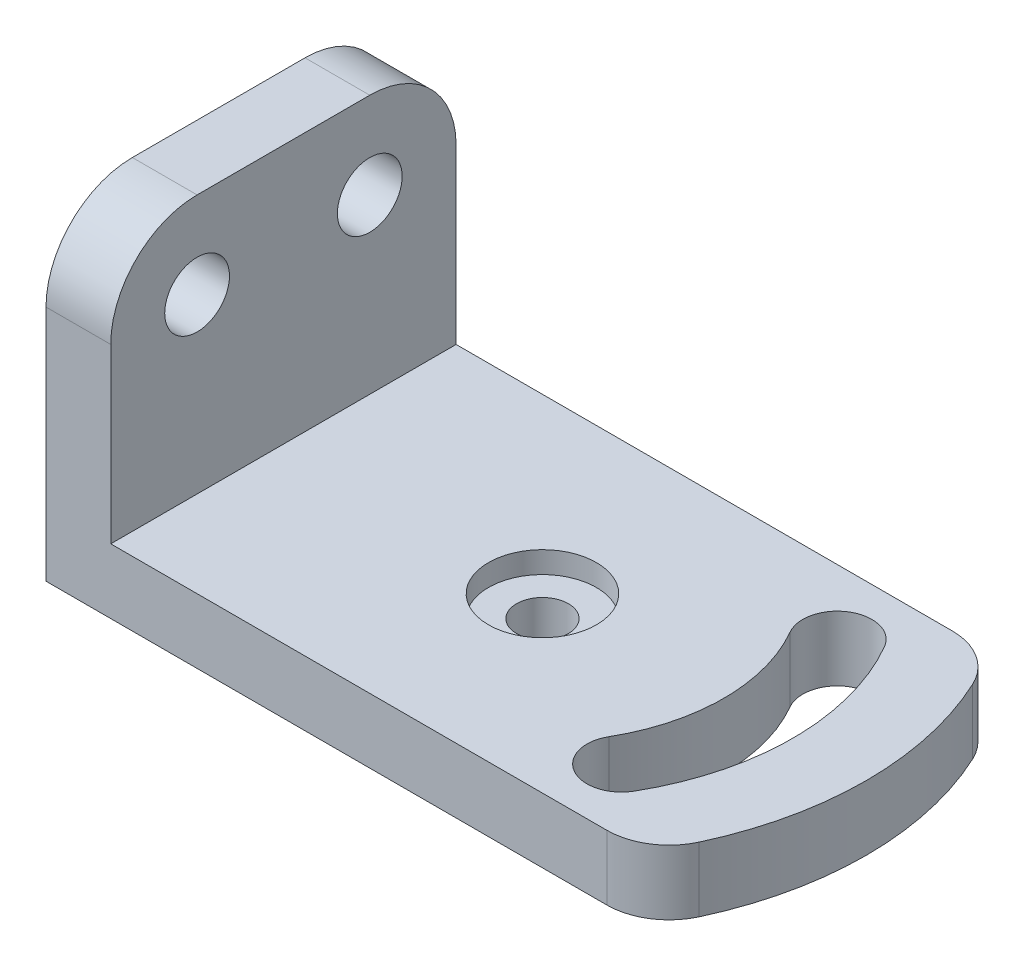
ISO-10303-21;
HEADER;
FILE_DESCRIPTION(('STEP AP214'),'2;1');
FILE_NAME('part.step','',(''),(''),'','','');
FILE_SCHEMA(('AUTOMOTIVE_DESIGN { 1 0 10303 214 1 1 1 1 }'));
ENDSEC;
DATA;
#1=APPLICATION_CONTEXT('core data for automotive mechanical design processes');
#2=APPLICATION_PROTOCOL_DEFINITION('international standard','automotive_design',2000,#1);
#3=PRODUCT_CONTEXT('',#1,'mechanical');
#4=PRODUCT('Part','Part','',(#3));
#5=PRODUCT_RELATED_PRODUCT_CATEGORY('part','',(#4));
#6=PRODUCT_DEFINITION_FORMATION('','',#4);
#7=PRODUCT_DEFINITION_CONTEXT('part definition',#1,'design');
#8=PRODUCT_DEFINITION('design','',#6,#7);
#9=PRODUCT_DEFINITION_SHAPE('','',#8);
#10=(LENGTH_UNIT() NAMED_UNIT(*) SI_UNIT(.MILLI.,.METRE.));
#11=(NAMED_UNIT(*) PLANE_ANGLE_UNIT() SI_UNIT($,.RADIAN.));
#12=(NAMED_UNIT(*) SI_UNIT($,.STERADIAN.) SOLID_ANGLE_UNIT());
#13=UNCERTAINTY_MEASURE_WITH_UNIT(LENGTH_MEASURE(1.E-05),#10,'distance_accuracy_value','');
#14=(GEOMETRIC_REPRESENTATION_CONTEXT(3) GLOBAL_UNCERTAINTY_ASSIGNED_CONTEXT((#13)) GLOBAL_UNIT_ASSIGNED_CONTEXT((#10,
#11,#12)) REPRESENTATION_CONTEXT('',''));
#15=CARTESIAN_POINT('',(0.,0.,0.));
#16=DIRECTION('',(0.,0.,1.));
#17=DIRECTION('',(1.,0.,0.));
#18=AXIS2_PLACEMENT_3D('',#15,#16,#17);
#19=CARTESIAN_POINT('',(15.,75.,0.));
#20=DIRECTION('',(-1.,0.,0.));
#21=DIRECTION('',(0.,0.,1.));
#22=AXIS2_PLACEMENT_3D('',#19,#20,#21);
#23=PLANE('',#22);
#24=CARTESIAN_POINT('',(15.,55.,-20.));
#25=DIRECTION('',(-1.,0.,0.));
#26=DIRECTION('',(0.,0.,1.));
#27=AXIS2_PLACEMENT_3D('',#24,#25,#26);
#28=CIRCLE('',#27,7.5);
#29=CARTESIAN_POINT('',(15.,55.,-12.5));
#30=VERTEX_POINT('',#29);
#31=EDGE_CURVE('E328',#30,#30,#28,.F.);
#32=ORIENTED_EDGE('',*,*,#31,.F.);
#33=EDGE_LOOP('',(#32));
#34=FACE_BOUND('',#33,.T.);
#35=CARTESIAN_POINT('',(15.,55.,20.));
#36=DIRECTION('',(-1.,0.,0.));
#37=DIRECTION('',(0.,0.,1.));
#38=AXIS2_PLACEMENT_3D('',#35,#36,#37);
#39=CIRCLE('',#38,20.);
#40=CARTESIAN_POINT('',(15.,55.,40.));
#41=VERTEX_POINT('',#40);
#42=CARTESIAN_POINT('',(15.,75.,20.));
#43=VERTEX_POINT('',#42);
#44=EDGE_CURVE('E186',#41,#43,#39,.T.);
#45=ORIENTED_EDGE('',*,*,#44,.F.);
#46=DIRECTION('',(0.,-1.,0.));
#47=VECTOR('',#46,1.);
#48=CARTESIAN_POINT('',(15.,75.,40.));
#49=LINE('',#48,#47);
#50=CARTESIAN_POINT('',(15.,15.,40.));
#51=VERTEX_POINT('',#50);
#52=EDGE_CURVE('E206',#41,#51,#49,.T.);
#53=ORIENTED_EDGE('',*,*,#52,.T.);
#54=DIRECTION('',(0.,0.,-1.));
#55=VECTOR('',#54,1.);
#56=CARTESIAN_POINT('',(15.,15.,0.));
#57=LINE('',#56,#55);
#58=CARTESIAN_POINT('',(15.,15.,-40.));
#59=VERTEX_POINT('',#58);
#60=EDGE_CURVE('E242',#51,#59,#57,.T.);
#61=ORIENTED_EDGE('',*,*,#60,.T.);
#62=DIRECTION('',(0.,-1.,0.));
#63=VECTOR('',#62,1.);
#64=CARTESIAN_POINT('',(15.,75.,-40.));
#65=LINE('',#64,#63);
#66=CARTESIAN_POINT('',(15.,55.,-40.));
#67=VERTEX_POINT('',#66);
#68=EDGE_CURVE('E94',#67,#59,#65,.T.);
#69=ORIENTED_EDGE('',*,*,#68,.F.);
#70=CARTESIAN_POINT('',(15.,55.,-20.));
#71=DIRECTION('',(-1.,0.,0.));
#72=DIRECTION('',(0.,0.,1.));
#73=AXIS2_PLACEMENT_3D('',#70,#71,#72);
#74=CIRCLE('',#73,20.);
#75=CARTESIAN_POINT('',(15.,75.,-20.));
#76=VERTEX_POINT('',#75);
#77=EDGE_CURVE('E339',#67,#76,#74,.F.);
#78=ORIENTED_EDGE('',*,*,#77,.T.);
#79=DIRECTION('',(0.,0.,-1.));
#80=VECTOR('',#79,1.);
#81=CARTESIAN_POINT('',(15.,75.,0.));
#82=LINE('',#81,#80);
#83=EDGE_CURVE('E210',#43,#76,#82,.T.);
#84=ORIENTED_EDGE('',*,*,#83,.F.);
#85=EDGE_LOOP('',(#45,#53,#61,#69,#78,#84));
#86=FACE_BOUND('',#85,.T.);
#87=CARTESIAN_POINT('',(15.,55.,20.));
#88=DIRECTION('',(-1.,0.,0.));
#89=DIRECTION('',(0.,0.,1.));
#90=AXIS2_PLACEMENT_3D('',#87,#88,#89);
#91=CIRCLE('',#90,7.5);
#92=CARTESIAN_POINT('',(15.,55.,27.5));
#93=VERTEX_POINT('',#92);
#94=EDGE_CURVE('E331',#93,#93,#91,.T.);
#95=ORIENTED_EDGE('',*,*,#94,.T.);
#96=EDGE_LOOP('',(#95));
#97=FACE_BOUND('',#96,.T.);
#98=ADVANCED_FACE('F87',(#34,#86,#97),#23,.F.);
#99=CARTESIAN_POINT('',(0.,75.,0.));
#100=DIRECTION('',(1.,0.,0.));
#101=DIRECTION('',(0.,0.,-1.));
#102=AXIS2_PLACEMENT_3D('',#99,#100,#101);
#103=PLANE('',#102);
#104=CARTESIAN_POINT('',(0.,55.,20.));
#105=DIRECTION('',(1.,0.,0.));
#106=DIRECTION('',(0.,0.,-1.));
#107=AXIS2_PLACEMENT_3D('',#104,#105,#106);
#108=CIRCLE('',#107,20.);
#109=CARTESIAN_POINT('',(0.,75.,20.));
#110=VERTEX_POINT('',#109);
#111=CARTESIAN_POINT('',(0.,55.,40.));
#112=VERTEX_POINT('',#111);
#113=EDGE_CURVE('E189',#110,#112,#108,.T.);
#114=ORIENTED_EDGE('',*,*,#113,.F.);
#115=DIRECTION('',(0.,0.,1.));
#116=VECTOR('',#115,1.);
#117=CARTESIAN_POINT('',(0.,75.,0.));
#118=LINE('',#117,#116);
#119=CARTESIAN_POINT('',(0.,75.,-20.));
#120=VERTEX_POINT('',#119);
#121=EDGE_CURVE('E203',#120,#110,#118,.T.);
#122=ORIENTED_EDGE('',*,*,#121,.F.);
#123=CARTESIAN_POINT('',(0.,55.,-20.));
#124=DIRECTION('',(1.,0.,0.));
#125=DIRECTION('',(0.,0.,-1.));
#126=AXIS2_PLACEMENT_3D('',#123,#124,#125);
#127=CIRCLE('',#126,20.);
#128=CARTESIAN_POINT('',(0.,55.,-40.));
#129=VERTEX_POINT('',#128);
#130=EDGE_CURVE('E342',#120,#129,#127,.F.);
#131=ORIENTED_EDGE('',*,*,#130,.T.);
#132=DIRECTION('',(0.,-1.,0.));
#133=VECTOR('',#132,1.);
#134=CARTESIAN_POINT('',(0.,75.,-40.));
#135=LINE('',#134,#133);
#136=CARTESIAN_POINT('',(0.,0.,-40.));
#137=VERTEX_POINT('',#136);
#138=EDGE_CURVE('E225',#129,#137,#135,.T.);
#139=ORIENTED_EDGE('',*,*,#138,.T.);
#140=DIRECTION('',(0.,0.,1.));
#141=VECTOR('',#140,1.);
#142=CARTESIAN_POINT('',(0.,0.,0.));
#143=LINE('',#142,#141);
#144=CARTESIAN_POINT('',(0.,0.,40.));
#145=VERTEX_POINT('',#144);
#146=EDGE_CURVE('E220',#137,#145,#143,.T.);
#147=ORIENTED_EDGE('',*,*,#146,.T.);
#148=DIRECTION('',(0.,-1.,0.));
#149=VECTOR('',#148,1.);
#150=CARTESIAN_POINT('',(0.,75.,40.));
#151=LINE('',#150,#149);
#152=EDGE_CURVE('E201',#112,#145,#151,.T.);
#153=ORIENTED_EDGE('',*,*,#152,.F.);
#154=EDGE_LOOP('',(#114,#122,#131,#139,#147,#153));
#155=FACE_BOUND('',#154,.T.);
#156=CARTESIAN_POINT('',(0.,55.,-20.));
#157=DIRECTION('',(1.,0.,0.));
#158=DIRECTION('',(0.,0.,-1.));
#159=AXIS2_PLACEMENT_3D('',#156,#157,#158);
#160=CIRCLE('',#159,7.5);
#161=CARTESIAN_POINT('',(0.,55.,-27.5));
#162=VERTEX_POINT('',#161);
#163=EDGE_CURVE('E341',#162,#162,#160,.F.);
#164=ORIENTED_EDGE('',*,*,#163,.F.);
#165=EDGE_LOOP('',(#164));
#166=FACE_BOUND('',#165,.T.);
#167=CARTESIAN_POINT('',(0.,55.,20.));
#168=DIRECTION('',(1.,0.,0.));
#169=DIRECTION('',(0.,0.,-1.));
#170=AXIS2_PLACEMENT_3D('',#167,#168,#169);
#171=CIRCLE('',#170,7.5);
#172=CARTESIAN_POINT('',(0.,55.,12.5));
#173=VERTEX_POINT('',#172);
#174=EDGE_CURVE('E343',#173,#173,#171,.T.);
#175=ORIENTED_EDGE('',*,*,#174,.T.);
#176=EDGE_LOOP('',(#175));
#177=FACE_BOUND('',#176,.T.);
#178=ADVANCED_FACE('F196',(#155,#166,#177),#103,.F.);
#179=CARTESIAN_POINT('',(0.,75.,40.));
#180=DIRECTION('',(0.,0.,-1.));
#181=DIRECTION('',(-1.,0.,0.));
#182=AXIS2_PLACEMENT_3D('',#179,#180,#181);
#183=PLANE('',#182);
#184=DIRECTION('',(1.,0.,0.));
#185=VECTOR('',#184,1.);
#186=CARTESIAN_POINT('',(0.,55.,40.));
#187=LINE('',#186,#185);
#188=EDGE_CURVE('E101',#112,#41,#187,.T.);
#189=ORIENTED_EDGE('',*,*,#188,.F.);
#190=ORIENTED_EDGE('',*,*,#152,.T.);
#191=DIRECTION('',(1.,0.,0.));
#192=VECTOR('',#191,1.);
#193=CARTESIAN_POINT('',(0.,0.,40.));
#194=LINE('',#193,#192);
#195=CARTESIAN_POINT('',(129.928343994125,0.,40.));
#196=VERTEX_POINT('',#195);
#197=EDGE_CURVE('E209',#145,#196,#194,.T.);
#198=ORIENTED_EDGE('',*,*,#197,.T.);
#199=DIRECTION('',(0.,-1.,0.));
#200=VECTOR('',#199,1.);
#201=CARTESIAN_POINT('',(129.928343994125,15.,40.));
#202=LINE('',#201,#200);
#203=CARTESIAN_POINT('',(129.928343994125,15.,40.));
#204=VERTEX_POINT('',#203);
#205=EDGE_CURVE('E268',#204,#196,#202,.T.);
#206=ORIENTED_EDGE('',*,*,#205,.F.);
#207=DIRECTION('',(1.,0.,0.));
#208=VECTOR('',#207,1.);
#209=CARTESIAN_POINT('',(0.,15.,40.));
#210=LINE('',#209,#208);
#211=EDGE_CURVE('E246',#51,#204,#210,.T.);
#212=ORIENTED_EDGE('',*,*,#211,.F.);
#213=ORIENTED_EDGE('',*,*,#52,.F.);
#214=EDGE_LOOP('',(#189,#190,#198,#206,#212,#213));
#215=FACE_BOUND('',#214,.T.);
#216=ADVANCED_FACE('F357',(#215),#183,.F.);
#217=CARTESIAN_POINT('',(0.,75.,0.));
#218=DIRECTION('',(0.,1.,0.));
#219=DIRECTION('',(0.,0.,1.));
#220=AXIS2_PLACEMENT_3D('',#217,#218,#219);
#221=PLANE('',#220);
#222=ORIENTED_EDGE('',*,*,#121,.T.);
#223=DIRECTION('',(1.,0.,0.));
#224=VECTOR('',#223,1.);
#225=CARTESIAN_POINT('',(0.,75.,20.));
#226=LINE('',#225,#224);
#227=EDGE_CURVE('E183',#110,#43,#226,.T.);
#228=ORIENTED_EDGE('',*,*,#227,.T.);
#229=ORIENTED_EDGE('',*,*,#83,.T.);
#230=DIRECTION('',(1.,0.,0.));
#231=VECTOR('',#230,1.);
#232=CARTESIAN_POINT('',(0.,75.,-20.));
#233=LINE('',#232,#231);
#234=EDGE_CURVE('E108',#120,#76,#233,.T.);
#235=ORIENTED_EDGE('',*,*,#234,.F.);
#236=EDGE_LOOP('',(#222,#228,#229,#235));
#237=FACE_BOUND('',#236,.T.);
#238=ADVANCED_FACE('F202',(#237),#221,.T.);
#239=CARTESIAN_POINT('',(0.,75.,-40.));
#240=DIRECTION('',(0.,0.,1.));
#241=DIRECTION('',(1.,0.,0.));
#242=AXIS2_PLACEMENT_3D('',#239,#240,#241);
#243=PLANE('',#242);
#244=ORIENTED_EDGE('',*,*,#138,.F.);
#245=DIRECTION('',(1.,0.,0.));
#246=VECTOR('',#245,1.);
#247=CARTESIAN_POINT('',(0.,55.,-40.));
#248=LINE('',#247,#246);
#249=EDGE_CURVE('E234',#129,#67,#248,.T.);
#250=ORIENTED_EDGE('',*,*,#249,.T.);
#251=ORIENTED_EDGE('',*,*,#68,.T.);
#252=DIRECTION('',(1.,0.,0.));
#253=VECTOR('',#252,1.);
#254=CARTESIAN_POINT('',(0.,15.,-40.));
#255=LINE('',#254,#253);
#256=CARTESIAN_POINT('',(129.928343994125,15.,-40.));
#257=VERTEX_POINT('',#256);
#258=EDGE_CURVE('E232',#59,#257,#255,.T.);
#259=ORIENTED_EDGE('',*,*,#258,.T.);
#260=DIRECTION('',(0.,-1.,0.));
#261=VECTOR('',#260,1.);
#262=CARTESIAN_POINT('',(129.928343994125,15.,-40.));
#263=LINE('',#262,#261);
#264=CARTESIAN_POINT('',(129.928343994125,0.,-40.));
#265=VERTEX_POINT('',#264);
#266=EDGE_CURVE('E304',#257,#265,#263,.T.);
#267=ORIENTED_EDGE('',*,*,#266,.T.);
#268=DIRECTION('',(-1.,0.,0.));
#269=VECTOR('',#268,1.);
#270=CARTESIAN_POINT('',(0.,0.,-40.));
#271=LINE('',#270,#269);
#272=EDGE_CURVE('E212',#265,#137,#271,.T.);
#273=ORIENTED_EDGE('',*,*,#272,.T.);
#274=EDGE_LOOP('',(#244,#250,#251,#259,#267,#273));
#275=FACE_BOUND('',#274,.T.);
#276=ADVANCED_FACE('F226',(#275),#243,.F.);
#277=CARTESIAN_POINT('',(0.,0.,0.));
#278=DIRECTION('',(0.,1.,0.));
#279=DIRECTION('',(0.,0.,1.));
#280=AXIS2_PLACEMENT_3D('',#277,#278,#279);
#281=PLANE('',#280);
#282=ORIENTED_EDGE('',*,*,#272,.F.);
#283=CARTESIAN_POINT('',(129.928343994125,0.,-25.6017567705269));
#284=DIRECTION('',(0.,1.,0.));
#285=DIRECTION('',(0.,0.,1.));
#286=AXIS2_PLACEMENT_3D('',#283,#284,#285);
#287=CIRCLE('',#286,14.3982432294731);
#288=CARTESIAN_POINT('',(142.978653080283,0.,-31.6844240186013));
#289=VERTEX_POINT('',#288);
#290=EDGE_CURVE('E277',#265,#289,#287,.F.);
#291=ORIENTED_EDGE('',*,*,#290,.T.);
#292=CARTESIAN_POINT('',(75.,0.,0.));
#293=DIRECTION('',(0.,1.,0.));
#294=DIRECTION('',(0.,0.,1.));
#295=AXIS2_PLACEMENT_3D('',#292,#293,#294);
#296=CIRCLE('',#295,75.);
#297=CARTESIAN_POINT('',(142.978653080283,0.,31.6844240186013));
#298=VERTEX_POINT('',#297);
#299=EDGE_CURVE('E275',#289,#298,#296,.F.);
#300=ORIENTED_EDGE('',*,*,#299,.T.);
#301=CARTESIAN_POINT('',(129.928343994125,0.,25.6017567705269));
#302=DIRECTION('',(0.,1.,0.));
#303=DIRECTION('',(0.,0.,1.));
#304=AXIS2_PLACEMENT_3D('',#301,#302,#303);
#305=CIRCLE('',#304,14.3982432294731);
#306=EDGE_CURVE('E267',#298,#196,#305,.F.);
#307=ORIENTED_EDGE('',*,*,#306,.T.);
#308=ORIENTED_EDGE('',*,*,#197,.F.);
#309=ORIENTED_EDGE('',*,*,#146,.F.);
#310=EDGE_LOOP('',(#282,#291,#300,#307,#308,#309));
#311=FACE_BOUND('',#310,.T.);
#312=CARTESIAN_POINT('',(118.301270189222,0.,-24.9999999999997));
#313=DIRECTION('',(0.,1.,0.));
#314=DIRECTION('',(0.,0.,1.));
#315=AXIS2_PLACEMENT_3D('',#312,#313,#314);
#316=CIRCLE('',#315,8.);
#317=CARTESIAN_POINT('',(125.229473419498,0.,-28.9999999999997));
#318=VERTEX_POINT('',#317);
#319=CARTESIAN_POINT('',(111.373066958947,0.,-20.9999999999998));
#320=VERTEX_POINT('',#319);
#321=EDGE_CURVE('E276',#318,#320,#316,.T.);
#322=ORIENTED_EDGE('',*,*,#321,.T.);
#323=CARTESIAN_POINT('',(75.,0.,0.));
#324=DIRECTION('',(0.,1.,0.));
#325=DIRECTION('',(0.,0.,1.));
#326=AXIS2_PLACEMENT_3D('',#323,#324,#325);
#327=CIRCLE('',#326,42.);
#328=CARTESIAN_POINT('',(111.373066958947,0.,20.9999999999998));
#329=VERTEX_POINT('',#328);
#330=EDGE_CURVE('E290',#329,#320,#327,.T.);
#331=ORIENTED_EDGE('',*,*,#330,.F.);
#332=CARTESIAN_POINT('',(118.301270189222,0.,24.9999999999998));
#333=DIRECTION('',(0.,1.,0.));
#334=DIRECTION('',(0.,0.,1.));
#335=AXIS2_PLACEMENT_3D('',#332,#333,#334);
#336=CIRCLE('',#335,8.);
#337=CARTESIAN_POINT('',(125.229473419498,0.,28.9999999999997));
#338=VERTEX_POINT('',#337);
#339=EDGE_CURVE('E283',#329,#338,#336,.T.);
#340=ORIENTED_EDGE('',*,*,#339,.T.);
#341=CARTESIAN_POINT('',(75.,0.,0.));
#342=DIRECTION('',(0.,1.,0.));
#343=DIRECTION('',(0.,0.,1.));
#344=AXIS2_PLACEMENT_3D('',#341,#342,#343);
#345=CIRCLE('',#344,58.);
#346=EDGE_CURVE('E285',#338,#318,#345,.T.);
#347=ORIENTED_EDGE('',*,*,#346,.T.);
#348=EDGE_LOOP('',(#322,#331,#340,#347));
#349=FACE_BOUND('',#348,.T.);
#350=CARTESIAN_POINT('',(75.,0.,0.));
#351=DIRECTION('',(0.,1.,0.));
#352=DIRECTION('',(0.,0.,1.));
#353=AXIS2_PLACEMENT_3D('',#350,#351,#352);
#354=CIRCLE('',#353,6.);
#355=CARTESIAN_POINT('',(75.,0.,6.));
#356=VERTEX_POINT('',#355);
#357=EDGE_CURVE('E326',#356,#356,#354,.T.);
#358=ORIENTED_EDGE('',*,*,#357,.T.);
#359=EDGE_LOOP('',(#358));
#360=FACE_BOUND('',#359,.T.);
#361=ADVANCED_FACE('F320',(#311,#349,#360),#281,.F.);
#362=CARTESIAN_POINT('',(118.301270189222,15.,-24.9999999999997));
#363=DIRECTION('',(0.,-1.,0.));
#364=DIRECTION('',(0.,0.,-1.));
#365=AXIS2_PLACEMENT_3D('',#362,#363,#364);
#366=CYLINDRICAL_SURFACE('',#365,8.);
#367=ORIENTED_EDGE('',*,*,#321,.F.);
#368=DIRECTION('',(0.,-1.,0.));
#369=VECTOR('',#368,1.);
#370=CARTESIAN_POINT('',(125.229473419498,15.,-28.9999999999997));
#371=LINE('',#370,#369);
#372=CARTESIAN_POINT('',(125.229473419498,15.,-28.9999999999997));
#373=VERTEX_POINT('',#372);
#374=EDGE_CURVE('E217',#373,#318,#371,.T.);
#375=ORIENTED_EDGE('',*,*,#374,.F.);
#376=CARTESIAN_POINT('',(118.301270189222,15.,-24.9999999999997));
#377=DIRECTION('',(0.,1.,0.));
#378=DIRECTION('',(0.,0.,1.));
#379=AXIS2_PLACEMENT_3D('',#376,#377,#378);
#380=CIRCLE('',#379,8.);
#381=CARTESIAN_POINT('',(111.373066958947,15.,-20.9999999999998));
#382=VERTEX_POINT('',#381);
#383=EDGE_CURVE('E260',#373,#382,#380,.T.);
#384=ORIENTED_EDGE('',*,*,#383,.T.);
#385=DIRECTION('',(0.,-1.,0.));
#386=VECTOR('',#385,1.);
#387=CARTESIAN_POINT('',(111.373066958947,15.,-20.9999999999998));
#388=LINE('',#387,#386);
#389=EDGE_CURVE('E295',#382,#320,#388,.T.);
#390=ORIENTED_EDGE('',*,*,#389,.T.);
#391=EDGE_LOOP('',(#367,#375,#384,#390));
#392=FACE_BOUND('',#391,.T.);
#393=ADVANCED_FACE('F402',(#392),#366,.F.);
#394=CARTESIAN_POINT('',(75.,15.,0.));
#395=DIRECTION('',(0.,-1.,0.));
#396=DIRECTION('',(0.,0.,-1.));
#397=AXIS2_PLACEMENT_3D('',#394,#395,#396);
#398=CYLINDRICAL_SURFACE('',#397,58.);
#399=ORIENTED_EDGE('',*,*,#346,.F.);
#400=DIRECTION('',(0.,-1.,0.));
#401=VECTOR('',#400,1.);
#402=CARTESIAN_POINT('',(125.229473419498,15.,28.9999999999997));
#403=LINE('',#402,#401);
#404=CARTESIAN_POINT('',(125.229473419498,15.,28.9999999999997));
#405=VERTEX_POINT('',#404);
#406=EDGE_CURVE('E300',#405,#338,#403,.T.);
#407=ORIENTED_EDGE('',*,*,#406,.F.);
#408=CARTESIAN_POINT('',(75.,15.,0.));
#409=DIRECTION('',(0.,1.,0.));
#410=DIRECTION('',(0.,0.,1.));
#411=AXIS2_PLACEMENT_3D('',#408,#409,#410);
#412=CIRCLE('',#411,58.);
#413=EDGE_CURVE('E257',#405,#373,#412,.T.);
#414=ORIENTED_EDGE('',*,*,#413,.T.);
#415=ORIENTED_EDGE('',*,*,#374,.T.);
#416=EDGE_LOOP('',(#399,#407,#414,#415));
#417=FACE_BOUND('',#416,.T.);
#418=ADVANCED_FACE('F399',(#417),#398,.F.);
#419=CARTESIAN_POINT('',(118.301270189222,15.,24.9999999999998));
#420=DIRECTION('',(0.,-1.,0.));
#421=DIRECTION('',(0.,0.,-1.));
#422=AXIS2_PLACEMENT_3D('',#419,#420,#421);
#423=CYLINDRICAL_SURFACE('',#422,8.);
#424=ORIENTED_EDGE('',*,*,#339,.F.);
#425=DIRECTION('',(0.,-1.,0.));
#426=VECTOR('',#425,1.);
#427=CARTESIAN_POINT('',(111.373066958947,15.,20.9999999999998));
#428=LINE('',#427,#426);
#429=CARTESIAN_POINT('',(111.373066958947,15.,20.9999999999998));
#430=VERTEX_POINT('',#429);
#431=EDGE_CURVE('E294',#430,#329,#428,.T.);
#432=ORIENTED_EDGE('',*,*,#431,.F.);
#433=CARTESIAN_POINT('',(118.301270189222,15.,24.9999999999998));
#434=DIRECTION('',(0.,1.,0.));
#435=DIRECTION('',(0.,0.,1.));
#436=AXIS2_PLACEMENT_3D('',#433,#434,#435);
#437=CIRCLE('',#436,8.);
#438=EDGE_CURVE('E263',#430,#405,#437,.T.);
#439=ORIENTED_EDGE('',*,*,#438,.T.);
#440=ORIENTED_EDGE('',*,*,#406,.T.);
#441=EDGE_LOOP('',(#424,#432,#439,#440));
#442=FACE_BOUND('',#441,.T.);
#443=ADVANCED_FACE('F391',(#442),#423,.F.);
#444=CARTESIAN_POINT('',(129.928343994125,15.,25.6017567705269));
#445=DIRECTION('',(0.,-1.,0.));
#446=DIRECTION('',(0.,0.,-1.));
#447=AXIS2_PLACEMENT_3D('',#444,#445,#446);
#448=CYLINDRICAL_SURFACE('',#447,14.3982432294731);
#449=ORIENTED_EDGE('',*,*,#306,.F.);
#450=DIRECTION('',(0.,-1.,0.));
#451=VECTOR('',#450,1.);
#452=CARTESIAN_POINT('',(142.978653080283,15.,31.6844240186013));
#453=LINE('',#452,#451);
#454=CARTESIAN_POINT('',(142.978653080283,15.,31.6844240186013));
#455=VERTEX_POINT('',#454);
#456=EDGE_CURVE('E293',#455,#298,#453,.T.);
#457=ORIENTED_EDGE('',*,*,#456,.F.);
#458=CARTESIAN_POINT('',(129.928343994125,15.,25.6017567705269));
#459=DIRECTION('',(0.,1.,0.));
#460=DIRECTION('',(0.,0.,1.));
#461=AXIS2_PLACEMENT_3D('',#458,#459,#460);
#462=CIRCLE('',#461,14.3982432294731);
#463=EDGE_CURVE('E292',#455,#204,#462,.F.);
#464=ORIENTED_EDGE('',*,*,#463,.T.);
#465=ORIENTED_EDGE('',*,*,#205,.T.);
#466=EDGE_LOOP('',(#449,#457,#464,#465));
#467=FACE_BOUND('',#466,.T.);
#468=ADVANCED_FACE('F311',(#467),#448,.T.);
#469=CARTESIAN_POINT('',(75.,15.,0.));
#470=DIRECTION('',(0.,-1.,0.));
#471=DIRECTION('',(0.,0.,-1.));
#472=AXIS2_PLACEMENT_3D('',#469,#470,#471);
#473=CYLINDRICAL_SURFACE('',#472,75.);
#474=ORIENTED_EDGE('',*,*,#299,.F.);
#475=DIRECTION('',(0.,-1.,0.));
#476=VECTOR('',#475,1.);
#477=CARTESIAN_POINT('',(142.978653080283,15.,-31.6844240186013));
#478=LINE('',#477,#476);
#479=CARTESIAN_POINT('',(142.978653080283,15.,-31.6844240186013));
#480=VERTEX_POINT('',#479);
#481=EDGE_CURVE('E301',#480,#289,#478,.T.);
#482=ORIENTED_EDGE('',*,*,#481,.F.);
#483=CARTESIAN_POINT('',(75.,15.,0.));
#484=DIRECTION('',(0.,1.,0.));
#485=DIRECTION('',(0.,0.,1.));
#486=AXIS2_PLACEMENT_3D('',#483,#484,#485);
#487=CIRCLE('',#486,75.);
#488=EDGE_CURVE('E309',#480,#455,#487,.F.);
#489=ORIENTED_EDGE('',*,*,#488,.T.);
#490=ORIENTED_EDGE('',*,*,#456,.T.);
#491=EDGE_LOOP('',(#474,#482,#489,#490));
#492=FACE_BOUND('',#491,.T.);
#493=ADVANCED_FACE('F310',(#492),#473,.T.);
#494=CARTESIAN_POINT('',(129.928343994125,15.,-25.6017567705269));
#495=DIRECTION('',(0.,-1.,0.));
#496=DIRECTION('',(0.,0.,-1.));
#497=AXIS2_PLACEMENT_3D('',#494,#495,#496);
#498=CYLINDRICAL_SURFACE('',#497,14.3982432294731);
#499=ORIENTED_EDGE('',*,*,#290,.F.);
#500=ORIENTED_EDGE('',*,*,#266,.F.);
#501=CARTESIAN_POINT('',(129.928343994125,15.,-25.6017567705269));
#502=DIRECTION('',(0.,1.,0.));
#503=DIRECTION('',(0.,0.,1.));
#504=AXIS2_PLACEMENT_3D('',#501,#502,#503);
#505=CIRCLE('',#504,14.3982432294731);
#506=EDGE_CURVE('E241',#257,#480,#505,.F.);
#507=ORIENTED_EDGE('',*,*,#506,.T.);
#508=ORIENTED_EDGE('',*,*,#481,.T.);
#509=EDGE_LOOP('',(#499,#500,#507,#508));
#510=FACE_BOUND('',#509,.T.);
#511=ADVANCED_FACE('F325',(#510),#498,.T.);
#512=CARTESIAN_POINT('',(75.,15.,0.));
#513=DIRECTION('',(0.,-1.,0.));
#514=DIRECTION('',(0.,0.,-1.));
#515=AXIS2_PLACEMENT_3D('',#512,#513,#514);
#516=CYLINDRICAL_SURFACE('',#515,12.5);
#517=CARTESIAN_POINT('',(75.,10.,0.));
#518=DIRECTION('',(0.,1.,0.));
#519=DIRECTION('',(0.,0.,1.));
#520=AXIS2_PLACEMENT_3D('',#517,#518,#519);
#521=CIRCLE('',#520,12.5);
#522=CARTESIAN_POINT('',(75.,10.,12.5));
#523=VERTEX_POINT('',#522);
#524=EDGE_CURVE('E12',#523,#523,#521,.T.);
#525=ORIENTED_EDGE('',*,*,#524,.F.);
#526=EDGE_LOOP('',(#525));
#527=FACE_BOUND('',#526,.T.);
#528=CARTESIAN_POINT('',(75.,15.,0.));
#529=DIRECTION('',(0.,1.,0.));
#530=DIRECTION('',(0.,0.,1.));
#531=AXIS2_PLACEMENT_3D('',#528,#529,#530);
#532=CIRCLE('',#531,12.5);
#533=CARTESIAN_POINT('',(75.,15.,12.5));
#534=VERTEX_POINT('',#533);
#535=EDGE_CURVE('E253',#534,#534,#532,.T.);
#536=ORIENTED_EDGE('',*,*,#535,.T.);
#537=EDGE_LOOP('',(#536));
#538=FACE_BOUND('',#537,.T.);
#539=ADVANCED_FACE('F395',(#527,#538),#516,.F.);
#540=CARTESIAN_POINT('',(75.,15.,0.));
#541=DIRECTION('',(0.,-1.,0.));
#542=DIRECTION('',(0.,0.,-1.));
#543=AXIS2_PLACEMENT_3D('',#540,#541,#542);
#544=CYLINDRICAL_SURFACE('',#543,42.);
#545=ORIENTED_EDGE('',*,*,#330,.T.);
#546=ORIENTED_EDGE('',*,*,#389,.F.);
#547=CARTESIAN_POINT('',(75.,15.,0.));
#548=DIRECTION('',(0.,1.,0.));
#549=DIRECTION('',(0.,0.,1.));
#550=AXIS2_PLACEMENT_3D('',#547,#548,#549);
#551=CIRCLE('',#550,42.);
#552=EDGE_CURVE('E266',#430,#382,#551,.T.);
#553=ORIENTED_EDGE('',*,*,#552,.F.);
#554=ORIENTED_EDGE('',*,*,#431,.T.);
#555=EDGE_LOOP('',(#545,#546,#553,#554));
#556=FACE_BOUND('',#555,.T.);
#557=ADVANCED_FACE('F386',(#556),#544,.T.);
#558=CARTESIAN_POINT('',(0.,15.,0.));
#559=DIRECTION('',(0.,1.,0.));
#560=DIRECTION('',(0.,0.,1.));
#561=AXIS2_PLACEMENT_3D('',#558,#559,#560);
#562=PLANE('',#561);
#563=ORIENTED_EDGE('',*,*,#463,.F.);
#564=ORIENTED_EDGE('',*,*,#488,.F.);
#565=ORIENTED_EDGE('',*,*,#506,.F.);
#566=ORIENTED_EDGE('',*,*,#258,.F.);
#567=ORIENTED_EDGE('',*,*,#60,.F.);
#568=ORIENTED_EDGE('',*,*,#211,.T.);
#569=EDGE_LOOP('',(#563,#564,#565,#566,#567,#568));
#570=FACE_BOUND('',#569,.T.);
#571=ORIENTED_EDGE('',*,*,#535,.F.);
#572=EDGE_LOOP('',(#571));
#573=FACE_BOUND('',#572,.T.);
#574=ORIENTED_EDGE('',*,*,#383,.F.);
#575=ORIENTED_EDGE('',*,*,#413,.F.);
#576=ORIENTED_EDGE('',*,*,#438,.F.);
#577=ORIENTED_EDGE('',*,*,#552,.T.);
#578=EDGE_LOOP('',(#574,#575,#576,#577));
#579=FACE_BOUND('',#578,.T.);
#580=ADVANCED_FACE('F239',(#570,#573,#579),#562,.T.);
#581=CARTESIAN_POINT('',(75.,10.,0.));
#582=DIRECTION('',(0.,-1.,0.));
#583=DIRECTION('',(0.,0.,-1.));
#584=AXIS2_PLACEMENT_3D('',#581,#582,#583);
#585=CYLINDRICAL_SURFACE('',#584,6.);
#586=CARTESIAN_POINT('',(75.,10.,0.));
#587=DIRECTION('',(0.,1.,0.));
#588=DIRECTION('',(0.,0.,1.));
#589=AXIS2_PLACEMENT_3D('',#586,#587,#588);
#590=CIRCLE('',#589,6.);
#591=CARTESIAN_POINT('',(75.,10.,6.));
#592=VERTEX_POINT('',#591);
#593=EDGE_CURVE('E272',#592,#592,#590,.T.);
#594=ORIENTED_EDGE('',*,*,#593,.T.);
#595=EDGE_LOOP('',(#594));
#596=FACE_BOUND('',#595,.T.);
#597=ORIENTED_EDGE('',*,*,#357,.F.);
#598=EDGE_LOOP('',(#597));
#599=FACE_BOUND('',#598,.T.);
#600=ADVANCED_FACE('F385',(#596,#599),#585,.F.);
#601=CARTESIAN_POINT('',(0.,10.,0.));
#602=DIRECTION('',(0.,1.,0.));
#603=DIRECTION('',(0.,0.,1.));
#604=AXIS2_PLACEMENT_3D('',#601,#602,#603);
#605=PLANE('',#604);
#606=ORIENTED_EDGE('',*,*,#593,.F.);
#607=EDGE_LOOP('',(#606));
#608=FACE_BOUND('',#607,.T.);
#609=ORIENTED_EDGE('',*,*,#524,.T.);
#610=EDGE_LOOP('',(#609));
#611=FACE_BOUND('',#610,.T.);
#612=ADVANCED_FACE('F361',(#608,#611),#605,.T.);
#613=CARTESIAN_POINT('',(0.,55.,20.));
#614=DIRECTION('',(1.,0.,0.));
#615=DIRECTION('',(0.,0.,-1.));
#616=AXIS2_PLACEMENT_3D('',#613,#614,#615);
#617=CYLINDRICAL_SURFACE('',#616,7.5);
#618=ORIENTED_EDGE('',*,*,#174,.F.);
#619=EDGE_LOOP('',(#618));
#620=FACE_BOUND('',#619,.T.);
#621=ORIENTED_EDGE('',*,*,#94,.F.);
#622=EDGE_LOOP('',(#621));
#623=FACE_BOUND('',#622,.T.);
#624=ADVANCED_FACE('F358',(#620,#623),#617,.F.);
#625=CARTESIAN_POINT('',(0.,55.,-20.));
#626=DIRECTION('',(1.,0.,0.));
#627=DIRECTION('',(0.,0.,-1.));
#628=AXIS2_PLACEMENT_3D('',#625,#626,#627);
#629=CYLINDRICAL_SURFACE('',#628,7.5);
#630=ORIENTED_EDGE('',*,*,#163,.T.);
#631=EDGE_LOOP('',(#630));
#632=FACE_BOUND('',#631,.T.);
#633=ORIENTED_EDGE('',*,*,#31,.T.);
#634=EDGE_LOOP('',(#633));
#635=FACE_BOUND('',#634,.T.);
#636=ADVANCED_FACE('F355',(#632,#635),#629,.F.);
#637=CARTESIAN_POINT('',(0.,55.,-20.));
#638=DIRECTION('',(1.,0.,0.));
#639=DIRECTION('',(0.,0.,-1.));
#640=AXIS2_PLACEMENT_3D('',#637,#638,#639);
#641=CYLINDRICAL_SURFACE('',#640,20.);
#642=ORIENTED_EDGE('',*,*,#249,.F.);
#643=ORIENTED_EDGE('',*,*,#130,.F.);
#644=ORIENTED_EDGE('',*,*,#234,.T.);
#645=ORIENTED_EDGE('',*,*,#77,.F.);
#646=EDGE_LOOP('',(#642,#643,#644,#645));
#647=FACE_BOUND('',#646,.T.);
#648=ADVANCED_FACE('F373',(#647),#641,.T.);
#649=CARTESIAN_POINT('',(0.,55.,20.));
#650=DIRECTION('',(1.,0.,0.));
#651=DIRECTION('',(0.,0.,-1.));
#652=AXIS2_PLACEMENT_3D('',#649,#650,#651);
#653=CYLINDRICAL_SURFACE('',#652,20.);
#654=ORIENTED_EDGE('',*,*,#44,.T.);
#655=ORIENTED_EDGE('',*,*,#227,.F.);
#656=ORIENTED_EDGE('',*,*,#113,.T.);
#657=ORIENTED_EDGE('',*,*,#188,.T.);
#658=EDGE_LOOP('',(#654,#655,#656,#657));
#659=FACE_BOUND('',#658,.T.);
#660=ADVANCED_FACE('F190',(#659),#653,.T.);
#661=CLOSED_SHELL('',(#98,#178,#216,#238,#276,#361,#393,#418,#443,#468,#493,#511,#539,#557,#580,
#600,#612,#624,#636,#648,#660));
#662=MANIFOLD_SOLID_BREP('B2',#661);
#663=ADVANCED_BREP_SHAPE_REPRESENTATION('',(#18,#662),#14);
#664=SHAPE_DEFINITION_REPRESENTATION(#9,#663);
ENDSEC;
END-ISO-10303-21;
